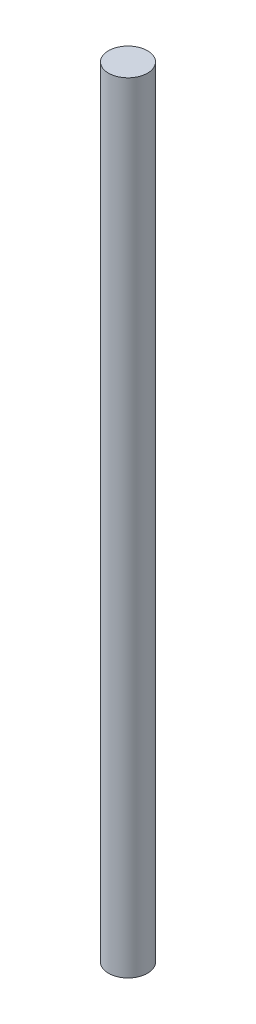
ISO-10303-21;
HEADER;
FILE_DESCRIPTION(('STEP AP214'),'2;1');
FILE_NAME('part.step','',(''),(''),'','','');
FILE_SCHEMA(('AUTOMOTIVE_DESIGN { 1 0 10303 214 1 1 1 1 }'));
ENDSEC;
DATA;
#1=APPLICATION_CONTEXT('core data for automotive mechanical design processes');
#2=APPLICATION_PROTOCOL_DEFINITION('international standard','automotive_design',2000,#1);
#3=PRODUCT_CONTEXT('',#1,'mechanical');
#4=PRODUCT('Part','Part','',(#3));
#5=PRODUCT_RELATED_PRODUCT_CATEGORY('part','',(#4));
#6=PRODUCT_DEFINITION_FORMATION('','',#4);
#7=PRODUCT_DEFINITION_CONTEXT('part definition',#1,'design');
#8=PRODUCT_DEFINITION('design','',#6,#7);
#9=PRODUCT_DEFINITION_SHAPE('','',#8);
#10=(LENGTH_UNIT() NAMED_UNIT(*) SI_UNIT(.MILLI.,.METRE.));
#11=(NAMED_UNIT(*) PLANE_ANGLE_UNIT() SI_UNIT($,.RADIAN.));
#12=(NAMED_UNIT(*) SI_UNIT($,.STERADIAN.) SOLID_ANGLE_UNIT());
#13=UNCERTAINTY_MEASURE_WITH_UNIT(LENGTH_MEASURE(1.E-05),#10,'distance_accuracy_value','');
#14=(GEOMETRIC_REPRESENTATION_CONTEXT(3) GLOBAL_UNCERTAINTY_ASSIGNED_CONTEXT((#13)) GLOBAL_UNIT_ASSIGNED_CONTEXT((#10,
#11,#12)) REPRESENTATION_CONTEXT('',''));
#15=CARTESIAN_POINT('',(0.,0.,0.));
#16=DIRECTION('',(0.,0.,1.));
#17=DIRECTION('',(1.,0.,0.));
#18=AXIS2_PLACEMENT_3D('',#15,#16,#17);
#19=CARTESIAN_POINT('',(0.,120.,0.));
#20=DIRECTION('',(0.,-1.,0.));
#21=DIRECTION('',(0.,0.,-1.));
#22=AXIS2_PLACEMENT_3D('',#19,#20,#21);
#23=CYLINDRICAL_SURFACE('',#22,3.);
#24=CARTESIAN_POINT('',(0.,120.,0.));
#25=DIRECTION('',(0.,1.,0.));
#26=DIRECTION('',(0.,0.,1.));
#27=AXIS2_PLACEMENT_3D('',#24,#25,#26);
#28=CIRCLE('',#27,3.);
#29=CARTESIAN_POINT('',(0.,120.,3.));
#30=VERTEX_POINT('',#29);
#31=EDGE_CURVE('E10',#30,#30,#28,.T.);
#32=ORIENTED_EDGE('',*,*,#31,.F.);
#33=EDGE_LOOP('',(#32));
#34=FACE_BOUND('',#33,.T.);
#35=CARTESIAN_POINT('',(0.,0.,0.));
#36=DIRECTION('',(0.,1.,0.));
#37=DIRECTION('',(0.,0.,1.));
#38=AXIS2_PLACEMENT_3D('',#35,#36,#37);
#39=CIRCLE('',#38,3.);
#40=CARTESIAN_POINT('',(0.,0.,3.));
#41=VERTEX_POINT('',#40);
#42=EDGE_CURVE('E40',#41,#41,#39,.T.);
#43=ORIENTED_EDGE('',*,*,#42,.T.);
#44=EDGE_LOOP('',(#43));
#45=FACE_BOUND('',#44,.T.);
#46=ADVANCED_FACE('F37',(#34,#45),#23,.T.);
#47=CARTESIAN_POINT('',(0.,120.,0.));
#48=DIRECTION('',(0.,1.,0.));
#49=DIRECTION('',(0.,0.,1.));
#50=AXIS2_PLACEMENT_3D('',#47,#48,#49);
#51=PLANE('',#50);
#52=ORIENTED_EDGE('',*,*,#31,.T.);
#53=EDGE_LOOP('',(#52));
#54=FACE_BOUND('',#53,.T.);
#55=ADVANCED_FACE('F54',(#54),#51,.T.);
#56=CARTESIAN_POINT('',(0.,0.,0.));
#57=DIRECTION('',(0.,1.,0.));
#58=DIRECTION('',(0.,0.,1.));
#59=AXIS2_PLACEMENT_3D('',#56,#57,#58);
#60=PLANE('',#59);
#61=ORIENTED_EDGE('',*,*,#42,.F.);
#62=EDGE_LOOP('',(#61));
#63=FACE_BOUND('',#62,.T.);
#64=ADVANCED_FACE('F52',(#63),#60,.F.);
#65=CLOSED_SHELL('',(#46,#55,#64));
#66=MANIFOLD_SOLID_BREP('B2',#65);
#67=ADVANCED_BREP_SHAPE_REPRESENTATION('',(#18,#66),#14);
#68=SHAPE_DEFINITION_REPRESENTATION(#9,#67);
ENDSEC;
END-ISO-10303-21;
